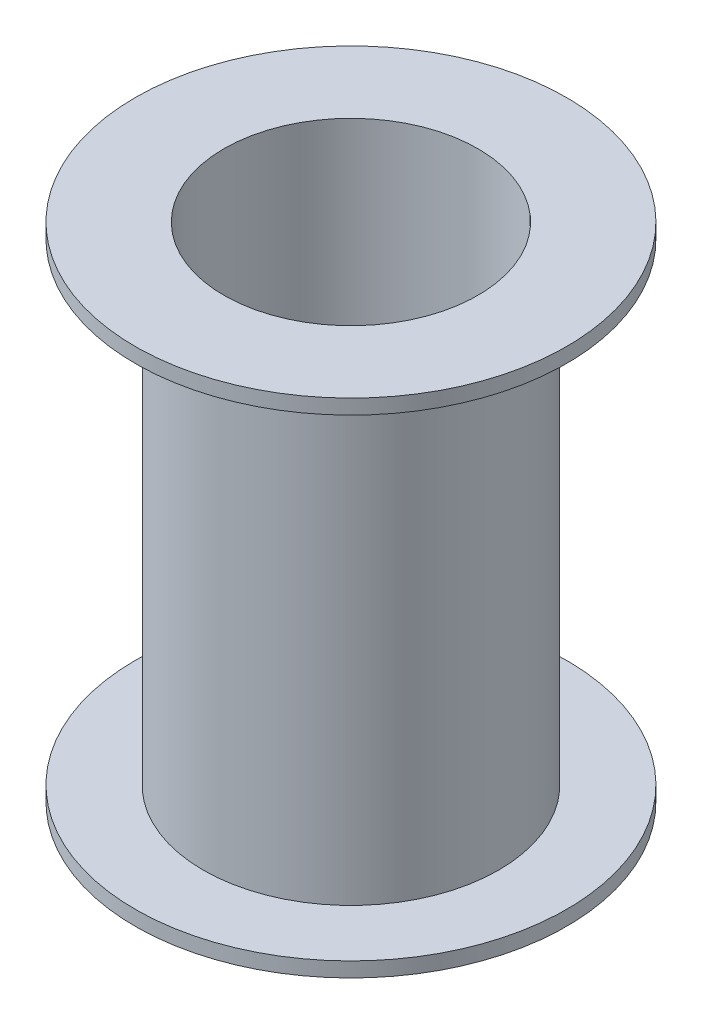
ISO-10303-21;
HEADER;
FILE_DESCRIPTION(('STEP AP214'),'2;1');
FILE_NAME('part.step','',(''),(''),'','','');
FILE_SCHEMA(('AUTOMOTIVE_DESIGN { 1 0 10303 214 1 1 1 1 }'));
ENDSEC;
DATA;
#1=APPLICATION_CONTEXT('core data for automotive mechanical design processes');
#2=APPLICATION_PROTOCOL_DEFINITION('international standard','automotive_design',2000,#1);
#3=PRODUCT_CONTEXT('',#1,'mechanical');
#4=PRODUCT('Part','Part','',(#3));
#5=PRODUCT_RELATED_PRODUCT_CATEGORY('part','',(#4));
#6=PRODUCT_DEFINITION_FORMATION('','',#4);
#7=PRODUCT_DEFINITION_CONTEXT('part definition',#1,'design');
#8=PRODUCT_DEFINITION('design','',#6,#7);
#9=PRODUCT_DEFINITION_SHAPE('','',#8);
#10=(LENGTH_UNIT() NAMED_UNIT(*) SI_UNIT(.MILLI.,.METRE.));
#11=(NAMED_UNIT(*) PLANE_ANGLE_UNIT() SI_UNIT($,.RADIAN.));
#12=(NAMED_UNIT(*) SI_UNIT($,.STERADIAN.) SOLID_ANGLE_UNIT());
#13=UNCERTAINTY_MEASURE_WITH_UNIT(LENGTH_MEASURE(1.E-05),#10,'distance_accuracy_value','');
#14=(GEOMETRIC_REPRESENTATION_CONTEXT(3) GLOBAL_UNCERTAINTY_ASSIGNED_CONTEXT((#13)) GLOBAL_UNIT_ASSIGNED_CONTEXT((#10,
#11,#12)) REPRESENTATION_CONTEXT('',''));
#15=CARTESIAN_POINT('',(0.,0.,0.));
#16=DIRECTION('',(0.,0.,1.));
#17=DIRECTION('',(1.,0.,0.));
#18=AXIS2_PLACEMENT_3D('',#15,#16,#17);
#19=CARTESIAN_POINT('',(0.,1.7,0.));
#20=DIRECTION('',(0.,1.,0.));
#21=DIRECTION('',(-1.,0.,0.));
#22=AXIS2_PLACEMENT_3D('',#19,#20,#21);
#23=CYLINDRICAL_SURFACE('',#22,0.730000000000001);
#24=CARTESIAN_POINT('',(0.,0.0499999999999999,0.));
#25=DIRECTION('',(0.,1.,0.));
#26=DIRECTION('',(-1.,0.,0.));
#27=AXIS2_PLACEMENT_3D('',#24,#25,#26);
#28=CIRCLE('',#27,0.730000000000001);
#29=CARTESIAN_POINT('',(-0.730000000000001,0.0499999999999999,0.));
#30=VERTEX_POINT('',#29);
#31=EDGE_CURVE('E10',#30,#30,#28,.T.);
#32=ORIENTED_EDGE('',*,*,#31,.F.);
#33=EDGE_LOOP('',(#32));
#34=FACE_BOUND('',#33,.T.);
#35=CARTESIAN_POINT('',(0.,0.,0.));
#36=DIRECTION('',(0.,1.,0.));
#37=DIRECTION('',(-1.,0.,0.));
#38=AXIS2_PLACEMENT_3D('',#35,#36,#37);
#39=CIRCLE('',#38,0.73);
#40=CARTESIAN_POINT('',(-0.73,0.,0.));
#41=VERTEX_POINT('',#40);
#42=EDGE_CURVE('E58',#41,#41,#39,.T.);
#43=ORIENTED_EDGE('',*,*,#42,.T.);
#44=EDGE_LOOP('',(#43));
#45=FACE_BOUND('',#44,.T.);
#46=ADVANCED_FACE('F30',(#34,#45),#23,.T.);
#47=CARTESIAN_POINT('',(0.730000000000001,0.05,0.));
#48=DIRECTION('',(0.,-1.,0.));
#49=DIRECTION('',(1.,0.,0.));
#50=AXIS2_PLACEMENT_3D('',#47,#48,#49);
#51=PLANE('',#50);
#52=CARTESIAN_POINT('',(0.,0.0499999999999999,0.));
#53=DIRECTION('',(0.,1.,0.));
#54=DIRECTION('',(-1.,0.,0.));
#55=AXIS2_PLACEMENT_3D('',#52,#53,#54);
#56=CIRCLE('',#55,0.5);
#57=CARTESIAN_POINT('',(-0.5,0.0499999999999999,0.));
#58=VERTEX_POINT('',#57);
#59=EDGE_CURVE('E36',#58,#58,#56,.T.);
#60=ORIENTED_EDGE('',*,*,#59,.F.);
#61=EDGE_LOOP('',(#60));
#62=FACE_BOUND('',#61,.T.);
#63=ORIENTED_EDGE('',*,*,#31,.T.);
#64=EDGE_LOOP('',(#63));
#65=FACE_BOUND('',#64,.T.);
#66=ADVANCED_FACE('F95',(#62,#65),#51,.F.);
#67=CARTESIAN_POINT('',(0.,1.7,0.));
#68=DIRECTION('',(0.,1.,0.));
#69=DIRECTION('',(-1.,0.,0.));
#70=AXIS2_PLACEMENT_3D('',#67,#68,#69);
#71=CYLINDRICAL_SURFACE('',#70,0.5);
#72=CARTESIAN_POINT('',(0.,1.65,0.));
#73=DIRECTION('',(0.,1.,0.));
#74=DIRECTION('',(-1.,0.,0.));
#75=AXIS2_PLACEMENT_3D('',#72,#73,#74);
#76=CIRCLE('',#75,0.5);
#77=CARTESIAN_POINT('',(-0.5,1.65,0.));
#78=VERTEX_POINT('',#77);
#79=EDGE_CURVE('E40',#78,#78,#76,.T.);
#80=ORIENTED_EDGE('',*,*,#79,.F.);
#81=EDGE_LOOP('',(#80));
#82=FACE_BOUND('',#81,.T.);
#83=ORIENTED_EDGE('',*,*,#59,.T.);
#84=EDGE_LOOP('',(#83));
#85=FACE_BOUND('',#84,.T.);
#86=ADVANCED_FACE('F90',(#82,#85),#71,.T.);
#87=CARTESIAN_POINT('',(0.5,1.65,0.));
#88=DIRECTION('',(0.,1.,0.));
#89=DIRECTION('',(-1.,0.,0.));
#90=AXIS2_PLACEMENT_3D('',#87,#88,#89);
#91=PLANE('',#90);
#92=CARTESIAN_POINT('',(0.,1.65,0.));
#93=DIRECTION('',(0.,1.,0.));
#94=DIRECTION('',(-1.,0.,0.));
#95=AXIS2_PLACEMENT_3D('',#92,#93,#94);
#96=CIRCLE('',#95,0.730000000000001);
#97=CARTESIAN_POINT('',(-0.730000000000001,1.65,0.));
#98=VERTEX_POINT('',#97);
#99=EDGE_CURVE('E44',#98,#98,#96,.T.);
#100=ORIENTED_EDGE('',*,*,#99,.F.);
#101=EDGE_LOOP('',(#100));
#102=FACE_BOUND('',#101,.T.);
#103=ORIENTED_EDGE('',*,*,#79,.T.);
#104=EDGE_LOOP('',(#103));
#105=FACE_BOUND('',#104,.T.);
#106=ADVANCED_FACE('F84',(#102,#105),#91,.F.);
#107=CARTESIAN_POINT('',(0.,1.7,0.));
#108=DIRECTION('',(0.,1.,0.));
#109=DIRECTION('',(-1.,0.,0.));
#110=AXIS2_PLACEMENT_3D('',#107,#108,#109);
#111=CYLINDRICAL_SURFACE('',#110,0.730000000000001);
#112=CARTESIAN_POINT('',(0.,1.7,0.));
#113=DIRECTION('',(0.,1.,0.));
#114=DIRECTION('',(-1.,0.,0.));
#115=AXIS2_PLACEMENT_3D('',#112,#113,#114);
#116=CIRCLE('',#115,0.730000000000001);
#117=CARTESIAN_POINT('',(-0.730000000000001,1.7,0.));
#118=VERTEX_POINT('',#117);
#119=EDGE_CURVE('E49',#118,#118,#116,.T.);
#120=ORIENTED_EDGE('',*,*,#119,.F.);
#121=EDGE_LOOP('',(#120));
#122=FACE_BOUND('',#121,.T.);
#123=ORIENTED_EDGE('',*,*,#99,.T.);
#124=EDGE_LOOP('',(#123));
#125=FACE_BOUND('',#124,.T.);
#126=ADVANCED_FACE('F78',(#122,#125),#111,.T.);
#127=CARTESIAN_POINT('',(0.73,1.7,0.));
#128=DIRECTION('',(0.,-1.,0.));
#129=DIRECTION('',(1.,0.,0.));
#130=AXIS2_PLACEMENT_3D('',#127,#128,#129);
#131=PLANE('',#130);
#132=CARTESIAN_POINT('',(0.,1.7,0.));
#133=DIRECTION('',(0.,1.,0.));
#134=DIRECTION('',(-1.,0.,0.));
#135=AXIS2_PLACEMENT_3D('',#132,#133,#134);
#136=CIRCLE('',#135,0.43);
#137=CARTESIAN_POINT('',(-0.43,1.7,0.));
#138=VERTEX_POINT('',#137);
#139=EDGE_CURVE('E52',#138,#138,#136,.T.);
#140=ORIENTED_EDGE('',*,*,#139,.F.);
#141=EDGE_LOOP('',(#140));
#142=FACE_BOUND('',#141,.T.);
#143=ORIENTED_EDGE('',*,*,#119,.T.);
#144=EDGE_LOOP('',(#143));
#145=FACE_BOUND('',#144,.T.);
#146=ADVANCED_FACE('F72',(#142,#145),#131,.F.);
#147=CARTESIAN_POINT('',(0.,1.7,0.));
#148=DIRECTION('',(0.,1.,0.));
#149=DIRECTION('',(-1.,0.,0.));
#150=AXIS2_PLACEMENT_3D('',#147,#148,#149);
#151=CYLINDRICAL_SURFACE('',#150,0.43);
#152=CARTESIAN_POINT('',(0.,0.,0.));
#153=DIRECTION('',(0.,1.,0.));
#154=DIRECTION('',(-1.,0.,0.));
#155=AXIS2_PLACEMENT_3D('',#152,#153,#154);
#156=CIRCLE('',#155,0.43);
#157=CARTESIAN_POINT('',(-0.43,0.,0.));
#158=VERTEX_POINT('',#157);
#159=EDGE_CURVE('E55',#158,#158,#156,.T.);
#160=ORIENTED_EDGE('',*,*,#159,.F.);
#161=EDGE_LOOP('',(#160));
#162=FACE_BOUND('',#161,.T.);
#163=ORIENTED_EDGE('',*,*,#139,.T.);
#164=EDGE_LOOP('',(#163));
#165=FACE_BOUND('',#164,.T.);
#166=ADVANCED_FACE('F66',(#162,#165),#151,.F.);
#167=CARTESIAN_POINT('',(0.43,0.,0.));
#168=DIRECTION('',(0.,1.,0.));
#169=DIRECTION('',(-1.,0.,0.));
#170=AXIS2_PLACEMENT_3D('',#167,#168,#169);
#171=PLANE('',#170);
#172=ORIENTED_EDGE('',*,*,#42,.F.);
#173=EDGE_LOOP('',(#172));
#174=FACE_BOUND('',#173,.T.);
#175=ORIENTED_EDGE('',*,*,#159,.T.);
#176=EDGE_LOOP('',(#175));
#177=FACE_BOUND('',#176,.T.);
#178=ADVANCED_FACE('F63',(#174,#177),#171,.F.);
#179=CLOSED_SHELL('',(#46,#66,#86,#106,#126,#146,#166,#178));
#180=MANIFOLD_SOLID_BREP('B2',#179);
#181=ADVANCED_BREP_SHAPE_REPRESENTATION('',(#18,#180),#14);
#182=SHAPE_DEFINITION_REPRESENTATION(#9,#181);
ENDSEC;
END-ISO-10303-21;
